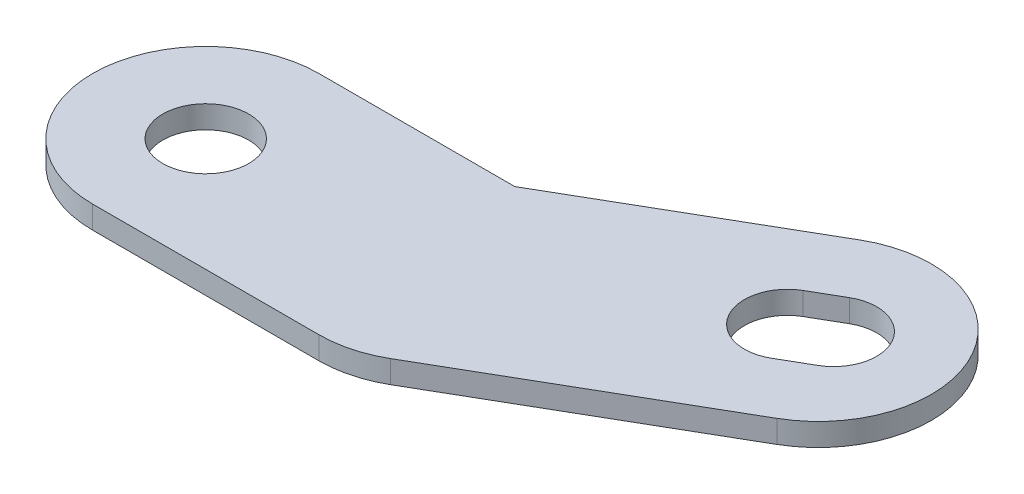
ISO-10303-21;
HEADER;
FILE_DESCRIPTION(('STEP AP214'),'2;1');
FILE_NAME('part.step','',(''),(''),'','','');
FILE_SCHEMA(('AUTOMOTIVE_DESIGN { 1 0 10303 214 1 1 1 1 }'));
ENDSEC;
DATA;
#1=APPLICATION_CONTEXT('core data for automotive mechanical design processes');
#2=APPLICATION_PROTOCOL_DEFINITION('international standard','automotive_design',2000,#1);
#3=PRODUCT_CONTEXT('',#1,'mechanical');
#4=PRODUCT('Part','Part','',(#3));
#5=PRODUCT_RELATED_PRODUCT_CATEGORY('part','',(#4));
#6=PRODUCT_DEFINITION_FORMATION('','',#4);
#7=PRODUCT_DEFINITION_CONTEXT('part definition',#1,'design');
#8=PRODUCT_DEFINITION('design','',#6,#7);
#9=PRODUCT_DEFINITION_SHAPE('','',#8);
#10=(LENGTH_UNIT() NAMED_UNIT(*) SI_UNIT(.MILLI.,.METRE.));
#11=(NAMED_UNIT(*) PLANE_ANGLE_UNIT() SI_UNIT($,.RADIAN.));
#12=(NAMED_UNIT(*) SI_UNIT($,.STERADIAN.) SOLID_ANGLE_UNIT());
#13=UNCERTAINTY_MEASURE_WITH_UNIT(LENGTH_MEASURE(1.E-05),#10,'distance_accuracy_value','');
#14=(GEOMETRIC_REPRESENTATION_CONTEXT(3) GLOBAL_UNCERTAINTY_ASSIGNED_CONTEXT((#13)) GLOBAL_UNIT_ASSIGNED_CONTEXT((#10,
#11,#12)) REPRESENTATION_CONTEXT('',''));
#15=CARTESIAN_POINT('',(0.,0.,0.));
#16=DIRECTION('',(0.,0.,1.));
#17=DIRECTION('',(1.,0.,0.));
#18=AXIS2_PLACEMENT_3D('',#15,#16,#17);
#19=CARTESIAN_POINT('',(11.959292143521,1.,-5.75000000000002));
#20=DIRECTION('',(0.,1.,0.));
#21=DIRECTION('',(0.,0.,1.));
#22=AXIS2_PLACEMENT_3D('',#19,#20,#21);
#23=CYLINDRICAL_SURFACE('',#22,1.9);
#24=DIRECTION('',(0.,1.,0.));
#25=VECTOR('',#24,1.);
#26=CARTESIAN_POINT('',(12.909292143521,1.,-4.10455173280958));
#27=LINE('',#26,#25);
#28=CARTESIAN_POINT('',(12.909292143521,0.,-4.10455173280958));
#29=VERTEX_POINT('',#28);
#30=CARTESIAN_POINT('',(12.909292143521,1.,-4.10455173280958));
#31=VERTEX_POINT('',#30);
#32=EDGE_CURVE('E11',#29,#31,#27,.T.);
#33=ORIENTED_EDGE('',*,*,#32,.F.);
#34=CARTESIAN_POINT('',(11.959292143521,0.,-5.75000000000002));
#35=DIRECTION('',(0.,1.,0.));
#36=DIRECTION('',(0.,0.,1.));
#37=AXIS2_PLACEMENT_3D('',#34,#35,#36);
#38=CIRCLE('',#37,1.9);
#39=CARTESIAN_POINT('',(11.009292143521,0.,-7.39544826719045));
#40=VERTEX_POINT('',#39);
#41=EDGE_CURVE('E116',#40,#29,#38,.T.);
#42=ORIENTED_EDGE('',*,*,#41,.F.);
#43=DIRECTION('',(0.,1.,0.));
#44=VECTOR('',#43,1.);
#45=CARTESIAN_POINT('',(11.009292143521,1.,-7.39544826719045));
#46=LINE('',#45,#44);
#47=CARTESIAN_POINT('',(11.009292143521,1.,-7.39544826719045));
#48=VERTEX_POINT('',#47);
#49=EDGE_CURVE('E50',#40,#48,#46,.T.);
#50=ORIENTED_EDGE('',*,*,#49,.T.);
#51=CARTESIAN_POINT('',(11.959292143521,1.,-5.75000000000002));
#52=DIRECTION('',(0.,1.,0.));
#53=DIRECTION('',(0.,0.,1.));
#54=AXIS2_PLACEMENT_3D('',#51,#52,#53);
#55=CIRCLE('',#54,1.9);
#56=EDGE_CURVE('E155',#48,#31,#55,.T.);
#57=ORIENTED_EDGE('',*,*,#56,.T.);
#58=EDGE_LOOP('',(#33,#42,#50,#57));
#59=FACE_BOUND('',#58,.T.);
#60=ADVANCED_FACE('F40',(#59),#23,.F.);
#61=CARTESIAN_POINT('',(-0.450000000000006,1.,-0.779422863406004));
#62=DIRECTION('',(0.500000000000001,0.,0.866025403784438));
#63=DIRECTION('',(0.866025403784438,0.,-0.500000000000001));
#64=AXIS2_PLACEMENT_3D('',#61,#62,#63);
#65=PLANE('',#64);
#66=ORIENTED_EDGE('',*,*,#49,.F.);
#67=DIRECTION('',(0.866025403784438,0.,-0.500000000000001));
#68=VECTOR('',#67,1.);
#69=CARTESIAN_POINT('',(-0.450000000000006,0.,-0.779422863406004));
#70=LINE('',#69,#68);
#71=CARTESIAN_POINT('',(12.3083302491977,0.,-8.14544826719045));
#72=VERTEX_POINT('',#71);
#73=EDGE_CURVE('E128',#40,#72,#70,.T.);
#74=ORIENTED_EDGE('',*,*,#73,.T.);
#75=DIRECTION('',(0.,1.,0.));
#76=VECTOR('',#75,1.);
#77=CARTESIAN_POINT('',(12.3083302491977,1.,-8.14544826719045));
#78=LINE('',#77,#76);
#79=CARTESIAN_POINT('',(12.3083302491977,1.,-8.14544826719045));
#80=VERTEX_POINT('',#79);
#81=EDGE_CURVE('E58',#72,#80,#78,.T.);
#82=ORIENTED_EDGE('',*,*,#81,.T.);
#83=DIRECTION('',(0.866025403784438,0.,-0.500000000000001));
#84=VECTOR('',#83,1.);
#85=CARTESIAN_POINT('',(-0.450000000000006,1.,-0.779422863406004));
#86=LINE('',#85,#84);
#87=EDGE_CURVE('E152',#48,#80,#86,.T.);
#88=ORIENTED_EDGE('',*,*,#87,.F.);
#89=EDGE_LOOP('',(#66,#74,#82,#88));
#90=FACE_BOUND('',#89,.T.);
#91=ADVANCED_FACE('F160',(#90),#65,.T.);
#92=CARTESIAN_POINT('',(13.2583302491977,1.,-6.50000000000002));
#93=DIRECTION('',(0.,1.,0.));
#94=DIRECTION('',(0.,0.,1.));
#95=AXIS2_PLACEMENT_3D('',#92,#93,#94);
#96=CYLINDRICAL_SURFACE('',#95,1.9);
#97=ORIENTED_EDGE('',*,*,#81,.F.);
#98=CARTESIAN_POINT('',(13.2583302491977,0.,-6.50000000000002));
#99=DIRECTION('',(0.,1.,0.));
#100=DIRECTION('',(0.,0.,1.));
#101=AXIS2_PLACEMENT_3D('',#98,#99,#100);
#102=CIRCLE('',#101,1.9);
#103=CARTESIAN_POINT('',(14.2083302491977,0.,-4.85455173280958));
#104=VERTEX_POINT('',#103);
#105=EDGE_CURVE('E115',#104,#72,#102,.T.);
#106=ORIENTED_EDGE('',*,*,#105,.F.);
#107=DIRECTION('',(0.,1.,0.));
#108=VECTOR('',#107,1.);
#109=CARTESIAN_POINT('',(14.2083302491977,1.,-4.85455173280958));
#110=LINE('',#109,#108);
#111=CARTESIAN_POINT('',(14.2083302491977,1.,-4.85455173280958));
#112=VERTEX_POINT('',#111);
#113=EDGE_CURVE('E44',#104,#112,#110,.T.);
#114=ORIENTED_EDGE('',*,*,#113,.T.);
#115=CARTESIAN_POINT('',(13.2583302491977,1.,-6.50000000000002));
#116=DIRECTION('',(0.,1.,0.));
#117=DIRECTION('',(0.,0.,1.));
#118=AXIS2_PLACEMENT_3D('',#115,#116,#117);
#119=CIRCLE('',#118,1.9);
#120=EDGE_CURVE('E235',#112,#80,#119,.T.);
#121=ORIENTED_EDGE('',*,*,#120,.T.);
#122=EDGE_LOOP('',(#97,#106,#114,#121));
#123=FACE_BOUND('',#122,.T.);
#124=ADVANCED_FACE('F118',(#123),#96,.F.);
#125=CARTESIAN_POINT('',(3.00000000000001,1.,5.19615242270663));
#126=DIRECTION('',(0.500000000000001,0.,0.866025403784438));
#127=DIRECTION('',(0.866025403784438,0.,-0.500000000000001));
#128=AXIS2_PLACEMENT_3D('',#125,#126,#127);
#129=PLANE('',#128);
#130=DIRECTION('',(0.,1.,0.));
#131=VECTOR('',#130,1.);
#132=CARTESIAN_POINT('',(4.50000000000001,1.,4.33012701892219));
#133=LINE('',#132,#131);
#134=CARTESIAN_POINT('',(4.50000000000001,0.,4.33012701892219));
#135=VERTEX_POINT('',#134);
#136=CARTESIAN_POINT('',(4.50000000000001,1.,4.33012701892219));
#137=VERTEX_POINT('',#136);
#138=EDGE_CURVE('E110',#135,#137,#133,.T.);
#139=ORIENTED_EDGE('',*,*,#138,.F.);
#140=DIRECTION('',(0.866025403784438,0.,-0.500000000000001));
#141=VECTOR('',#140,1.);
#142=CARTESIAN_POINT('',(3.00000000000001,0.,5.19615242270663));
#143=LINE('',#142,#141);
#144=CARTESIAN_POINT('',(15.3253175473055,0.,-1.91987298107783));
#145=VERTEX_POINT('',#144);
#146=EDGE_CURVE('E175',#135,#145,#143,.T.);
#147=ORIENTED_EDGE('',*,*,#146,.T.);
#148=DIRECTION('',(0.,1.,0.));
#149=VECTOR('',#148,1.);
#150=CARTESIAN_POINT('',(15.3253175473055,1.,-1.91987298107783));
#151=LINE('',#150,#149);
#152=CARTESIAN_POINT('',(15.3253175473055,1.,-1.91987298107783));
#153=VERTEX_POINT('',#152);
#154=EDGE_CURVE('E145',#145,#153,#151,.T.);
#155=ORIENTED_EDGE('',*,*,#154,.T.);
#156=DIRECTION('',(0.866025403784438,0.,-0.500000000000001));
#157=VECTOR('',#156,1.);
#158=CARTESIAN_POINT('',(3.00000000000001,1.,5.19615242270663));
#159=LINE('',#158,#157);
#160=EDGE_CURVE('E215',#137,#153,#159,.T.);
#161=ORIENTED_EDGE('',*,*,#160,.F.);
#162=EDGE_LOOP('',(#139,#147,#155,#161));
#163=FACE_BOUND('',#162,.T.);
#164=ADVANCED_FACE('F214',(#163),#129,.T.);
#165=CARTESIAN_POINT('',(12.8253175473055,1.,-6.25000000000002));
#166=DIRECTION('',(0.,1.,0.));
#167=DIRECTION('',(0.,0.,1.));
#168=AXIS2_PLACEMENT_3D('',#165,#166,#167);
#169=CYLINDRICAL_SURFACE('',#168,5.);
#170=ORIENTED_EDGE('',*,*,#154,.F.);
#171=CARTESIAN_POINT('',(12.8253175473055,0.,-6.25000000000002));
#172=DIRECTION('',(0.,1.,0.));
#173=DIRECTION('',(0.,0.,1.));
#174=AXIS2_PLACEMENT_3D('',#171,#172,#173);
#175=CIRCLE('',#174,5.);
#176=CARTESIAN_POINT('',(10.3253175473055,0.,-10.5801270189222));
#177=VERTEX_POINT('',#176);
#178=EDGE_CURVE('E173',#145,#177,#175,.T.);
#179=ORIENTED_EDGE('',*,*,#178,.T.);
#180=DIRECTION('',(0.,1.,0.));
#181=VECTOR('',#180,1.);
#182=CARTESIAN_POINT('',(10.3253175473055,1.,-10.5801270189222));
#183=LINE('',#182,#181);
#184=CARTESIAN_POINT('',(10.3253175473055,1.,-10.5801270189222));
#185=VERTEX_POINT('',#184);
#186=EDGE_CURVE('E142',#177,#185,#183,.T.);
#187=ORIENTED_EDGE('',*,*,#186,.T.);
#188=CARTESIAN_POINT('',(12.8253175473055,1.,-6.25000000000002));
#189=DIRECTION('',(0.,1.,0.));
#190=DIRECTION('',(0.,0.,1.));
#191=AXIS2_PLACEMENT_3D('',#188,#189,#190);
#192=CIRCLE('',#191,5.);
#193=EDGE_CURVE('E221',#153,#185,#192,.T.);
#194=ORIENTED_EDGE('',*,*,#193,.F.);
#195=EDGE_LOOP('',(#170,#179,#187,#194));
#196=FACE_BOUND('',#195,.T.);
#197=ADVANCED_FACE('F225',(#196),#169,.T.);
#198=CARTESIAN_POINT('',(-2.00000000000001,1.,-3.46410161513775));
#199=DIRECTION('',(0.500000000000001,0.,0.866025403784438));
#200=DIRECTION('',(0.866025403784438,0.,-0.500000000000001));
#201=AXIS2_PLACEMENT_3D('',#198,#199,#200);
#202=PLANE('',#201);
#203=ORIENTED_EDGE('',*,*,#186,.F.);
#204=DIRECTION('',(0.866025403784438,0.,-0.500000000000001));
#205=VECTOR('',#204,1.);
#206=CARTESIAN_POINT('',(-2.00000000000001,0.,-3.46410161513775));
#207=LINE('',#206,#205);
#208=CARTESIAN_POINT('',(0.660254037844377,0.,-5.));
#209=VERTEX_POINT('',#208);
#210=EDGE_CURVE('E170',#209,#177,#207,.T.);
#211=ORIENTED_EDGE('',*,*,#210,.F.);
#212=DIRECTION('',(0.,1.,0.));
#213=VECTOR('',#212,1.);
#214=CARTESIAN_POINT('',(0.660254037844377,1.,-5.));
#215=LINE('',#214,#213);
#216=CARTESIAN_POINT('',(0.660254037844377,1.,-5.));
#217=VERTEX_POINT('',#216);
#218=EDGE_CURVE('E139',#209,#217,#215,.T.);
#219=ORIENTED_EDGE('',*,*,#218,.T.);
#220=DIRECTION('',(0.866025403784438,0.,-0.500000000000001));
#221=VECTOR('',#220,1.);
#222=CARTESIAN_POINT('',(-2.00000000000001,1.,-3.46410161513775));
#223=LINE('',#222,#221);
#224=EDGE_CURVE('E226',#217,#185,#223,.T.);
#225=ORIENTED_EDGE('',*,*,#224,.T.);
#226=EDGE_LOOP('',(#203,#211,#219,#225));
#227=FACE_BOUND('',#226,.T.);
#228=ADVANCED_FACE('F242',(#227),#202,.F.);
#229=CARTESIAN_POINT('',(0.,1.,-5.));
#230=DIRECTION('',(0.,0.,1.));
#231=DIRECTION('',(1.,0.,0.));
#232=AXIS2_PLACEMENT_3D('',#229,#230,#231);
#233=PLANE('',#232);
#234=ORIENTED_EDGE('',*,*,#218,.F.);
#235=DIRECTION('',(1.,0.,0.));
#236=VECTOR('',#235,1.);
#237=CARTESIAN_POINT('',(0.,0.,-5.));
#238=LINE('',#237,#236);
#239=CARTESIAN_POINT('',(-8.,0.,-5.));
#240=VERTEX_POINT('',#239);
#241=EDGE_CURVE('E122',#240,#209,#238,.T.);
#242=ORIENTED_EDGE('',*,*,#241,.F.);
#243=DIRECTION('',(0.,1.,0.));
#244=VECTOR('',#243,1.);
#245=CARTESIAN_POINT('',(-8.,1.,-5.));
#246=LINE('',#245,#244);
#247=CARTESIAN_POINT('',(-8.,1.,-5.));
#248=VERTEX_POINT('',#247);
#249=EDGE_CURVE('E135',#240,#248,#246,.T.);
#250=ORIENTED_EDGE('',*,*,#249,.T.);
#251=DIRECTION('',(1.,0.,0.));
#252=VECTOR('',#251,1.);
#253=CARTESIAN_POINT('',(0.,1.,-5.));
#254=LINE('',#253,#252);
#255=EDGE_CURVE('E228',#248,#217,#254,.T.);
#256=ORIENTED_EDGE('',*,*,#255,.T.);
#257=EDGE_LOOP('',(#234,#242,#250,#256));
#258=FACE_BOUND('',#257,.T.);
#259=ADVANCED_FACE('F238',(#258),#233,.F.);
#260=CARTESIAN_POINT('',(-8.,1.,0.));
#261=DIRECTION('',(0.,1.,0.));
#262=DIRECTION('',(0.,0.,1.));
#263=AXIS2_PLACEMENT_3D('',#260,#261,#262);
#264=CYLINDRICAL_SURFACE('',#263,5.);
#265=ORIENTED_EDGE('',*,*,#249,.F.);
#266=CARTESIAN_POINT('',(-8.,0.,0.));
#267=DIRECTION('',(0.,1.,0.));
#268=DIRECTION('',(0.,0.,1.));
#269=AXIS2_PLACEMENT_3D('',#266,#267,#268);
#270=CIRCLE('',#269,5.);
#271=CARTESIAN_POINT('',(-8.,0.,5.));
#272=VERTEX_POINT('',#271);
#273=EDGE_CURVE('E119',#240,#272,#270,.T.);
#274=ORIENTED_EDGE('',*,*,#273,.T.);
#275=DIRECTION('',(0.,1.,0.));
#276=VECTOR('',#275,1.);
#277=CARTESIAN_POINT('',(-8.,1.,5.));
#278=LINE('',#277,#276);
#279=CARTESIAN_POINT('',(-8.,1.,5.));
#280=VERTEX_POINT('',#279);
#281=EDGE_CURVE('E132',#272,#280,#278,.T.);
#282=ORIENTED_EDGE('',*,*,#281,.T.);
#283=CARTESIAN_POINT('',(-8.,1.,0.));
#284=DIRECTION('',(0.,1.,0.));
#285=DIRECTION('',(0.,0.,1.));
#286=AXIS2_PLACEMENT_3D('',#283,#284,#285);
#287=CIRCLE('',#286,5.);
#288=EDGE_CURVE('E200',#248,#280,#287,.T.);
#289=ORIENTED_EDGE('',*,*,#288,.F.);
#290=EDGE_LOOP('',(#265,#274,#282,#289));
#291=FACE_BOUND('',#290,.T.);
#292=ADVANCED_FACE('F198',(#291),#264,.T.);
#293=CARTESIAN_POINT('',(0.,1.,5.));
#294=DIRECTION('',(0.,0.,1.));
#295=DIRECTION('',(1.,0.,0.));
#296=AXIS2_PLACEMENT_3D('',#293,#294,#295);
#297=PLANE('',#296);
#298=ORIENTED_EDGE('',*,*,#281,.F.);
#299=DIRECTION('',(1.,0.,0.));
#300=VECTOR('',#299,1.);
#301=CARTESIAN_POINT('',(0.,0.,5.));
#302=LINE('',#301,#300);
#303=CARTESIAN_POINT('',(2.,0.,5.));
#304=VERTEX_POINT('',#303);
#305=EDGE_CURVE('E164',#272,#304,#302,.T.);
#306=ORIENTED_EDGE('',*,*,#305,.T.);
#307=DIRECTION('',(0.,1.,0.));
#308=VECTOR('',#307,1.);
#309=CARTESIAN_POINT('',(2.,1.,5.));
#310=LINE('',#309,#308);
#311=CARTESIAN_POINT('',(2.,1.,5.));
#312=VERTEX_POINT('',#311);
#313=EDGE_CURVE('E136',#304,#312,#310,.T.);
#314=ORIENTED_EDGE('',*,*,#313,.T.);
#315=DIRECTION('',(1.,0.,0.));
#316=VECTOR('',#315,1.);
#317=CARTESIAN_POINT('',(0.,1.,5.));
#318=LINE('',#317,#316);
#319=EDGE_CURVE('E130',#280,#312,#318,.T.);
#320=ORIENTED_EDGE('',*,*,#319,.F.);
#321=EDGE_LOOP('',(#298,#306,#314,#320));
#322=FACE_BOUND('',#321,.T.);
#323=ADVANCED_FACE('F191',(#322),#297,.T.);
#324=CARTESIAN_POINT('',(2.,1.,0.));
#325=DIRECTION('',(0.,1.,0.));
#326=DIRECTION('',(0.,0.,1.));
#327=AXIS2_PLACEMENT_3D('',#324,#325,#326);
#328=CYLINDRICAL_SURFACE('',#327,5.);
#329=CARTESIAN_POINT('',(2.,0.,0.));
#330=DIRECTION('',(0.,1.,0.));
#331=DIRECTION('',(0.,0.,1.));
#332=AXIS2_PLACEMENT_3D('',#329,#330,#331);
#333=CIRCLE('',#332,5.);
#334=EDGE_CURVE('E126',#304,#135,#333,.T.);
#335=ORIENTED_EDGE('',*,*,#334,.T.);
#336=ORIENTED_EDGE('',*,*,#138,.T.);
#337=CARTESIAN_POINT('',(2.,1.,0.));
#338=DIRECTION('',(0.,1.,0.));
#339=DIRECTION('',(0.,0.,1.));
#340=AXIS2_PLACEMENT_3D('',#337,#338,#339);
#341=CIRCLE('',#340,5.);
#342=EDGE_CURVE('E223',#312,#137,#341,.T.);
#343=ORIENTED_EDGE('',*,*,#342,.F.);
#344=ORIENTED_EDGE('',*,*,#313,.F.);
#345=EDGE_LOOP('',(#335,#336,#343,#344));
#346=FACE_BOUND('',#345,.T.);
#347=ADVANCED_FACE('F182',(#346),#328,.T.);
#348=CARTESIAN_POINT('',(1.45000000000002,1.,2.51147367097489));
#349=DIRECTION('',(0.500000000000002,0.,0.866025403784437));
#350=DIRECTION('',(0.866025403784437,0.,-0.500000000000002));
#351=AXIS2_PLACEMENT_3D('',#348,#349,#350);
#352=PLANE('',#351);
#353=DIRECTION('',(0.866025403784437,0.,-0.500000000000002));
#354=VECTOR('',#353,1.);
#355=CARTESIAN_POINT('',(1.45000000000002,0.,2.51147367097489));
#356=LINE('',#355,#354);
#357=EDGE_CURVE('E103',#29,#104,#356,.T.);
#358=ORIENTED_EDGE('',*,*,#357,.F.);
#359=ORIENTED_EDGE('',*,*,#32,.T.);
#360=DIRECTION('',(0.866025403784437,0.,-0.500000000000002));
#361=VECTOR('',#360,1.);
#362=CARTESIAN_POINT('',(1.45000000000002,1.,2.51147367097489));
#363=LINE('',#362,#361);
#364=EDGE_CURVE('E106',#31,#112,#363,.T.);
#365=ORIENTED_EDGE('',*,*,#364,.T.);
#366=ORIENTED_EDGE('',*,*,#113,.F.);
#367=EDGE_LOOP('',(#358,#359,#365,#366));
#368=FACE_BOUND('',#367,.T.);
#369=ADVANCED_FACE('F42',(#368),#352,.F.);
#370=CARTESIAN_POINT('',(0.,1.,0.));
#371=DIRECTION('',(0.,1.,0.));
#372=DIRECTION('',(0.,0.,1.));
#373=AXIS2_PLACEMENT_3D('',#370,#371,#372);
#374=PLANE('',#373);
#375=CARTESIAN_POINT('',(-8.,1.,0.));
#376=DIRECTION('',(0.,1.,0.));
#377=DIRECTION('',(0.,0.,1.));
#378=AXIS2_PLACEMENT_3D('',#375,#376,#377);
#379=CIRCLE('',#378,1.89865);
#380=CARTESIAN_POINT('',(-8.,1.,1.89865));
#381=VERTEX_POINT('',#380);
#382=EDGE_CURVE('E355',#381,#381,#379,.T.);
#383=ORIENTED_EDGE('',*,*,#382,.F.);
#384=EDGE_LOOP('',(#383));
#385=FACE_BOUND('',#384,.T.);
#386=ORIENTED_EDGE('',*,*,#319,.T.);
#387=ORIENTED_EDGE('',*,*,#342,.T.);
#388=ORIENTED_EDGE('',*,*,#160,.T.);
#389=ORIENTED_EDGE('',*,*,#193,.T.);
#390=ORIENTED_EDGE('',*,*,#224,.F.);
#391=ORIENTED_EDGE('',*,*,#255,.F.);
#392=ORIENTED_EDGE('',*,*,#288,.T.);
#393=EDGE_LOOP('',(#386,#387,#388,#389,#390,#391,#392));
#394=FACE_BOUND('',#393,.T.);
#395=ORIENTED_EDGE('',*,*,#120,.F.);
#396=ORIENTED_EDGE('',*,*,#364,.F.);
#397=ORIENTED_EDGE('',*,*,#56,.F.);
#398=ORIENTED_EDGE('',*,*,#87,.T.);
#399=EDGE_LOOP('',(#395,#396,#397,#398));
#400=FACE_BOUND('',#399,.T.);
#401=ADVANCED_FACE('F158',(#385,#394,#400),#374,.T.);
#402=CARTESIAN_POINT('',(0.,0.,0.));
#403=DIRECTION('',(0.,1.,0.));
#404=DIRECTION('',(0.,0.,1.));
#405=AXIS2_PLACEMENT_3D('',#402,#403,#404);
#406=PLANE('',#405);
#407=CARTESIAN_POINT('',(-8.,0.,0.));
#408=DIRECTION('',(0.,1.,0.));
#409=DIRECTION('',(0.,0.,1.));
#410=AXIS2_PLACEMENT_3D('',#407,#408,#409);
#411=CIRCLE('',#410,1.89865);
#412=CARTESIAN_POINT('',(-8.,0.,1.89865));
#413=VERTEX_POINT('',#412);
#414=EDGE_CURVE('E166',#413,#413,#411,.T.);
#415=ORIENTED_EDGE('',*,*,#414,.T.);
#416=EDGE_LOOP('',(#415));
#417=FACE_BOUND('',#416,.T.);
#418=ORIENTED_EDGE('',*,*,#305,.F.);
#419=ORIENTED_EDGE('',*,*,#273,.F.);
#420=ORIENTED_EDGE('',*,*,#241,.T.);
#421=ORIENTED_EDGE('',*,*,#210,.T.);
#422=ORIENTED_EDGE('',*,*,#178,.F.);
#423=ORIENTED_EDGE('',*,*,#146,.F.);
#424=ORIENTED_EDGE('',*,*,#334,.F.);
#425=EDGE_LOOP('',(#418,#419,#420,#421,#422,#423,#424));
#426=FACE_BOUND('',#425,.T.);
#427=ORIENTED_EDGE('',*,*,#105,.T.);
#428=ORIENTED_EDGE('',*,*,#73,.F.);
#429=ORIENTED_EDGE('',*,*,#41,.T.);
#430=ORIENTED_EDGE('',*,*,#357,.T.);
#431=EDGE_LOOP('',(#427,#428,#429,#430));
#432=FACE_BOUND('',#431,.T.);
#433=ADVANCED_FACE('F113',(#417,#426,#432),#406,.F.);
#434=CARTESIAN_POINT('',(-8.,1.,0.));
#435=DIRECTION('',(0.,1.,0.));
#436=DIRECTION('',(0.,0.,1.));
#437=AXIS2_PLACEMENT_3D('',#434,#435,#436);
#438=CYLINDRICAL_SURFACE('',#437,1.89865);
#439=ORIENTED_EDGE('',*,*,#414,.F.);
#440=EDGE_LOOP('',(#439));
#441=FACE_BOUND('',#440,.T.);
#442=ORIENTED_EDGE('',*,*,#382,.T.);
#443=EDGE_LOOP('',(#442));
#444=FACE_BOUND('',#443,.T.);
#445=ADVANCED_FACE('F335',(#441,#444),#438,.F.);
#446=CLOSED_SHELL('',(#60,#91,#124,#164,#197,#228,#259,#292,#323,#347,#369,#401,#433,#445));
#447=MANIFOLD_SOLID_BREP('B2',#446);
#448=ADVANCED_BREP_SHAPE_REPRESENTATION('',(#18,#447),#14);
#449=SHAPE_DEFINITION_REPRESENTATION(#9,#448);
ENDSEC;
END-ISO-10303-21;
